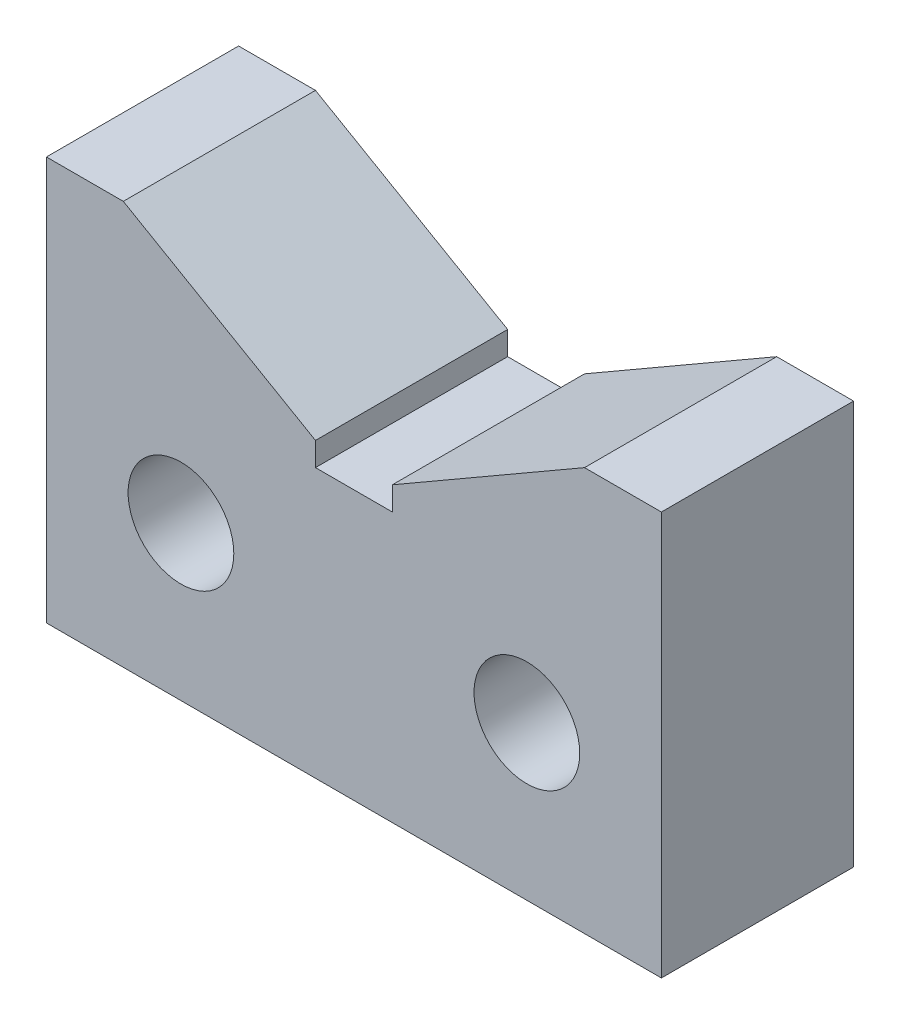
ISO-10303-21;
HEADER;
FILE_DESCRIPTION(('STEP AP214'),'2;1');
FILE_NAME('part.step','',(''),(''),'','','');
FILE_SCHEMA(('AUTOMOTIVE_DESIGN { 1 0 10303 214 1 1 1 1 }'));
ENDSEC;
DATA;
#1=APPLICATION_CONTEXT('core data for automotive mechanical design processes');
#2=APPLICATION_PROTOCOL_DEFINITION('international standard','automotive_design',2000,#1);
#3=PRODUCT_CONTEXT('',#1,'mechanical');
#4=PRODUCT('Part','Part','',(#3));
#5=PRODUCT_RELATED_PRODUCT_CATEGORY('part','',(#4));
#6=PRODUCT_DEFINITION_FORMATION('','',#4);
#7=PRODUCT_DEFINITION_CONTEXT('part definition',#1,'design');
#8=PRODUCT_DEFINITION('design','',#6,#7);
#9=PRODUCT_DEFINITION_SHAPE('','',#8);
#10=(LENGTH_UNIT() NAMED_UNIT(*) SI_UNIT(.MILLI.,.METRE.));
#11=(NAMED_UNIT(*) PLANE_ANGLE_UNIT() SI_UNIT($,.RADIAN.));
#12=(NAMED_UNIT(*) SI_UNIT($,.STERADIAN.) SOLID_ANGLE_UNIT());
#13=UNCERTAINTY_MEASURE_WITH_UNIT(LENGTH_MEASURE(1.E-05),#10,'distance_accuracy_value','');
#14=(GEOMETRIC_REPRESENTATION_CONTEXT(3) GLOBAL_UNCERTAINTY_ASSIGNED_CONTEXT((#13)) GLOBAL_UNIT_ASSIGNED_CONTEXT((#10,
#11,#12)) REPRESENTATION_CONTEXT('',''));
#15=CARTESIAN_POINT('',(0.,0.,0.));
#16=DIRECTION('',(0.,0.,1.));
#17=DIRECTION('',(1.,0.,0.));
#18=AXIS2_PLACEMENT_3D('',#15,#16,#17);
#19=CARTESIAN_POINT('',(0.,0.,10.));
#20=DIRECTION('',(0.,-1.,0.));
#21=DIRECTION('',(0.,0.,-1.));
#22=AXIS2_PLACEMENT_3D('',#19,#20,#21);
#23=PLANE('',#22);
#24=DIRECTION('',(-1.,0.,0.));
#25=VECTOR('',#24,1.);
#26=CARTESIAN_POINT('',(0.,0.,0.));
#27=LINE('',#26,#25);
#28=CARTESIAN_POINT('',(16.,0.,0.));
#29=VERTEX_POINT('',#28);
#30=CARTESIAN_POINT('',(-16.,0.,0.));
#31=VERTEX_POINT('',#30);
#32=EDGE_CURVE('E153',#29,#31,#27,.T.);
#33=ORIENTED_EDGE('',*,*,#32,.F.);
#34=DIRECTION('',(0.,0.,-1.));
#35=VECTOR('',#34,1.);
#36=CARTESIAN_POINT('',(16.,0.,10.));
#37=LINE('',#36,#35);
#38=CARTESIAN_POINT('',(16.,0.,10.));
#39=VERTEX_POINT('',#38);
#40=EDGE_CURVE('E11',#39,#29,#37,.T.);
#41=ORIENTED_EDGE('',*,*,#40,.F.);
#42=DIRECTION('',(-1.,0.,0.));
#43=VECTOR('',#42,1.);
#44=CARTESIAN_POINT('',(0.,0.,10.));
#45=LINE('',#44,#43);
#46=CARTESIAN_POINT('',(-16.,0.,10.));
#47=VERTEX_POINT('',#46);
#48=EDGE_CURVE('E254',#39,#47,#45,.T.);
#49=ORIENTED_EDGE('',*,*,#48,.T.);
#50=DIRECTION('',(0.,0.,-1.));
#51=VECTOR('',#50,1.);
#52=CARTESIAN_POINT('',(-16.,0.,10.));
#53=LINE('',#52,#51);
#54=EDGE_CURVE('E56',#47,#31,#53,.T.);
#55=ORIENTED_EDGE('',*,*,#54,.T.);
#56=EDGE_LOOP('',(#33,#41,#49,#55));
#57=FACE_BOUND('',#56,.T.);
#58=ADVANCED_FACE('F39',(#57),#23,.T.);
#59=CARTESIAN_POINT('',(16.,0.,10.));
#60=DIRECTION('',(-1.,0.,0.));
#61=DIRECTION('',(0.,0.,1.));
#62=AXIS2_PLACEMENT_3D('',#59,#60,#61);
#63=PLANE('',#62);
#64=DIRECTION('',(0.,1.,0.));
#65=VECTOR('',#64,1.);
#66=CARTESIAN_POINT('',(16.,0.,0.));
#67=LINE('',#66,#65);
#68=CARTESIAN_POINT('',(16.,21.,0.));
#69=VERTEX_POINT('',#68);
#70=EDGE_CURVE('E155',#29,#69,#67,.T.);
#71=ORIENTED_EDGE('',*,*,#70,.T.);
#72=DIRECTION('',(0.,0.,-1.));
#73=VECTOR('',#72,1.);
#74=CARTESIAN_POINT('',(16.,21.,10.));
#75=LINE('',#74,#73);
#76=CARTESIAN_POINT('',(16.,21.,10.));
#77=VERTEX_POINT('',#76);
#78=EDGE_CURVE('E48',#77,#69,#75,.T.);
#79=ORIENTED_EDGE('',*,*,#78,.F.);
#80=DIRECTION('',(0.,1.,0.));
#81=VECTOR('',#80,1.);
#82=CARTESIAN_POINT('',(16.,0.,10.));
#83=LINE('',#82,#81);
#84=EDGE_CURVE('E256',#39,#77,#83,.T.);
#85=ORIENTED_EDGE('',*,*,#84,.F.);
#86=ORIENTED_EDGE('',*,*,#40,.T.);
#87=EDGE_LOOP('',(#71,#79,#85,#86));
#88=FACE_BOUND('',#87,.T.);
#89=ADVANCED_FACE('F205',(#88),#63,.F.);
#90=CARTESIAN_POINT('',(0.,21.,10.));
#91=DIRECTION('',(0.,-1.,0.));
#92=DIRECTION('',(0.,0.,-1.));
#93=AXIS2_PLACEMENT_3D('',#90,#91,#92);
#94=PLANE('',#93);
#95=DIRECTION('',(-1.,0.,0.));
#96=VECTOR('',#95,1.);
#97=CARTESIAN_POINT('',(0.,21.,0.));
#98=LINE('',#97,#96);
#99=CARTESIAN_POINT('',(12.,21.,0.));
#100=VERTEX_POINT('',#99);
#101=EDGE_CURVE('E158',#69,#100,#98,.T.);
#102=ORIENTED_EDGE('',*,*,#101,.T.);
#103=DIRECTION('',(0.,0.,-1.));
#104=VECTOR('',#103,1.);
#105=CARTESIAN_POINT('',(12.,21.,10.));
#106=LINE('',#105,#104);
#107=CARTESIAN_POINT('',(12.,21.,10.));
#108=VERTEX_POINT('',#107);
#109=EDGE_CURVE('E193',#108,#100,#106,.T.);
#110=ORIENTED_EDGE('',*,*,#109,.F.);
#111=DIRECTION('',(-1.,0.,0.));
#112=VECTOR('',#111,1.);
#113=CARTESIAN_POINT('',(0.,21.,10.));
#114=LINE('',#113,#112);
#115=EDGE_CURVE('E201',#77,#108,#114,.T.);
#116=ORIENTED_EDGE('',*,*,#115,.F.);
#117=ORIENTED_EDGE('',*,*,#78,.T.);
#118=EDGE_LOOP('',(#102,#110,#116,#117));
#119=FACE_BOUND('',#118,.T.);
#120=ADVANCED_FACE('F198',(#119),#94,.F.);
#121=CARTESIAN_POINT('',(-6.0932667397366,10.5538475772934,10.));
#122=DIRECTION('',(0.499999999999998,-0.86602540378444,0.));
#123=DIRECTION('',(0.86602540378444,0.499999999999998,0.));
#124=AXIS2_PLACEMENT_3D('',#121,#122,#123);
#125=PLANE('',#124);
#126=DIRECTION('',(-0.86602540378444,-0.499999999999998,0.));
#127=VECTOR('',#126,1.);
#128=CARTESIAN_POINT('',(-6.0932667397366,10.5538475772934,0.));
#129=LINE('',#128,#127);
#130=CARTESIAN_POINT('',(2.,15.2264973081038,0.));
#131=VERTEX_POINT('',#130);
#132=EDGE_CURVE('E161',#100,#131,#129,.T.);
#133=ORIENTED_EDGE('',*,*,#132,.T.);
#134=DIRECTION('',(0.,0.,-1.));
#135=VECTOR('',#134,1.);
#136=CARTESIAN_POINT('',(2.,15.2264973081038,10.));
#137=LINE('',#136,#135);
#138=CARTESIAN_POINT('',(2.,15.2264973081038,10.));
#139=VERTEX_POINT('',#138);
#140=EDGE_CURVE('E190',#139,#131,#137,.T.);
#141=ORIENTED_EDGE('',*,*,#140,.F.);
#142=DIRECTION('',(-0.86602540378444,-0.499999999999998,0.));
#143=VECTOR('',#142,1.);
#144=CARTESIAN_POINT('',(-6.0932667397366,10.5538475772934,10.));
#145=LINE('',#144,#143);
#146=EDGE_CURVE('E261',#108,#139,#145,.T.);
#147=ORIENTED_EDGE('',*,*,#146,.F.);
#148=ORIENTED_EDGE('',*,*,#109,.T.);
#149=EDGE_LOOP('',(#133,#141,#147,#148));
#150=FACE_BOUND('',#149,.T.);
#151=ADVANCED_FACE('F217',(#150),#125,.F.);
#152=CARTESIAN_POINT('',(2.00000000000002,0.,10.));
#153=DIRECTION('',(1.,0.,0.));
#154=DIRECTION('',(0.,1.,0.));
#155=AXIS2_PLACEMENT_3D('',#152,#153,#154);
#156=PLANE('',#155);
#157=DIRECTION('',(0.,-1.,0.));
#158=VECTOR('',#157,1.);
#159=CARTESIAN_POINT('',(2.00000000000002,0.,0.));
#160=LINE('',#159,#158);
#161=CARTESIAN_POINT('',(2.,14.,0.));
#162=VERTEX_POINT('',#161);
#163=EDGE_CURVE('E164',#131,#162,#160,.T.);
#164=ORIENTED_EDGE('',*,*,#163,.T.);
#165=DIRECTION('',(0.,0.,-1.));
#166=VECTOR('',#165,1.);
#167=CARTESIAN_POINT('',(2.,14.,10.));
#168=LINE('',#167,#166);
#169=CARTESIAN_POINT('',(2.,14.,10.));
#170=VERTEX_POINT('',#169);
#171=EDGE_CURVE('E188',#170,#162,#168,.T.);
#172=ORIENTED_EDGE('',*,*,#171,.F.);
#173=DIRECTION('',(0.,-1.,0.));
#174=VECTOR('',#173,1.);
#175=CARTESIAN_POINT('',(2.00000000000002,0.,10.));
#176=LINE('',#175,#174);
#177=EDGE_CURVE('E264',#139,#170,#176,.T.);
#178=ORIENTED_EDGE('',*,*,#177,.F.);
#179=ORIENTED_EDGE('',*,*,#140,.T.);
#180=EDGE_LOOP('',(#164,#172,#178,#179));
#181=FACE_BOUND('',#180,.T.);
#182=ADVANCED_FACE('F220',(#181),#156,.F.);
#183=CARTESIAN_POINT('',(0.,14.,10.));
#184=DIRECTION('',(0.,1.,0.));
#185=DIRECTION('',(0.,0.,1.));
#186=AXIS2_PLACEMENT_3D('',#183,#184,#185);
#187=PLANE('',#186);
#188=DIRECTION('',(1.,0.,0.));
#189=VECTOR('',#188,1.);
#190=CARTESIAN_POINT('',(0.,14.,0.));
#191=LINE('',#190,#189);
#192=CARTESIAN_POINT('',(-2.,14.,0.));
#193=VERTEX_POINT('',#192);
#194=EDGE_CURVE('E167',#193,#162,#191,.T.);
#195=ORIENTED_EDGE('',*,*,#194,.F.);
#196=DIRECTION('',(0.,0.,-1.));
#197=VECTOR('',#196,1.);
#198=CARTESIAN_POINT('',(-2.,14.,10.));
#199=LINE('',#198,#197);
#200=CARTESIAN_POINT('',(-2.,14.,10.));
#201=VERTEX_POINT('',#200);
#202=EDGE_CURVE('E186',#201,#193,#199,.T.);
#203=ORIENTED_EDGE('',*,*,#202,.F.);
#204=DIRECTION('',(1.,0.,0.));
#205=VECTOR('',#204,1.);
#206=CARTESIAN_POINT('',(0.,14.,10.));
#207=LINE('',#206,#205);
#208=EDGE_CURVE('E266',#201,#170,#207,.T.);
#209=ORIENTED_EDGE('',*,*,#208,.T.);
#210=ORIENTED_EDGE('',*,*,#171,.T.);
#211=EDGE_LOOP('',(#195,#203,#209,#210));
#212=FACE_BOUND('',#211,.T.);
#213=ADVANCED_FACE('F224',(#212),#187,.T.);
#214=CARTESIAN_POINT('',(-2.00000000000002,0.,10.));
#215=DIRECTION('',(1.,0.,0.));
#216=DIRECTION('',(0.,1.,0.));
#217=AXIS2_PLACEMENT_3D('',#214,#215,#216);
#218=PLANE('',#217);
#219=DIRECTION('',(0.,-1.,0.));
#220=VECTOR('',#219,1.);
#221=CARTESIAN_POINT('',(-2.00000000000002,0.,0.));
#222=LINE('',#221,#220);
#223=CARTESIAN_POINT('',(-2.,15.2264973081038,0.));
#224=VERTEX_POINT('',#223);
#225=EDGE_CURVE('E170',#224,#193,#222,.T.);
#226=ORIENTED_EDGE('',*,*,#225,.F.);
#227=DIRECTION('',(0.,0.,-1.));
#228=VECTOR('',#227,1.);
#229=CARTESIAN_POINT('',(-2.,15.2264973081038,10.));
#230=LINE('',#229,#228);
#231=CARTESIAN_POINT('',(-2.,15.2264973081038,10.));
#232=VERTEX_POINT('',#231);
#233=EDGE_CURVE('E127',#232,#224,#230,.T.);
#234=ORIENTED_EDGE('',*,*,#233,.F.);
#235=DIRECTION('',(0.,-1.,0.));
#236=VECTOR('',#235,1.);
#237=CARTESIAN_POINT('',(-2.00000000000002,0.,10.));
#238=LINE('',#237,#236);
#239=EDGE_CURVE('E139',#232,#201,#238,.T.);
#240=ORIENTED_EDGE('',*,*,#239,.T.);
#241=ORIENTED_EDGE('',*,*,#202,.T.);
#242=EDGE_LOOP('',(#226,#234,#240,#241));
#243=FACE_BOUND('',#242,.T.);
#244=ADVANCED_FACE('F228',(#243),#218,.T.);
#245=CARTESIAN_POINT('',(6.0932667397366,10.5538475772934,10.));
#246=DIRECTION('',(0.499999999999998,0.86602540378444,0.));
#247=DIRECTION('',(-0.86602540378444,0.499999999999998,0.));
#248=AXIS2_PLACEMENT_3D('',#245,#246,#247);
#249=PLANE('',#248);
#250=DIRECTION('',(0.86602540378444,-0.499999999999998,0.));
#251=VECTOR('',#250,1.);
#252=CARTESIAN_POINT('',(6.0932667397366,10.5538475772934,0.));
#253=LINE('',#252,#251);
#254=CARTESIAN_POINT('',(-12.,21.,0.));
#255=VERTEX_POINT('',#254);
#256=EDGE_CURVE('E123',#255,#224,#253,.T.);
#257=ORIENTED_EDGE('',*,*,#256,.F.);
#258=DIRECTION('',(0.,0.,-1.));
#259=VECTOR('',#258,1.);
#260=CARTESIAN_POINT('',(-12.,21.,10.));
#261=LINE('',#260,#259);
#262=CARTESIAN_POINT('',(-12.,21.,10.));
#263=VERTEX_POINT('',#262);
#264=EDGE_CURVE('E118',#263,#255,#261,.T.);
#265=ORIENTED_EDGE('',*,*,#264,.F.);
#266=DIRECTION('',(0.86602540378444,-0.499999999999998,0.));
#267=VECTOR('',#266,1.);
#268=CARTESIAN_POINT('',(6.0932667397366,10.5538475772934,10.));
#269=LINE('',#268,#267);
#270=EDGE_CURVE('E121',#263,#232,#269,.T.);
#271=ORIENTED_EDGE('',*,*,#270,.T.);
#272=ORIENTED_EDGE('',*,*,#233,.T.);
#273=EDGE_LOOP('',(#257,#265,#271,#272));
#274=FACE_BOUND('',#273,.T.);
#275=ADVANCED_FACE('F120',(#274),#249,.T.);
#276=CARTESIAN_POINT('',(0.,21.,10.));
#277=DIRECTION('',(0.,1.,0.));
#278=DIRECTION('',(0.,0.,1.));
#279=AXIS2_PLACEMENT_3D('',#276,#277,#278);
#280=PLANE('',#279);
#281=DIRECTION('',(1.,0.,0.));
#282=VECTOR('',#281,1.);
#283=CARTESIAN_POINT('',(0.,21.,0.));
#284=LINE('',#283,#282);
#285=CARTESIAN_POINT('',(-16.,21.,0.));
#286=VERTEX_POINT('',#285);
#287=EDGE_CURVE('E174',#286,#255,#284,.T.);
#288=ORIENTED_EDGE('',*,*,#287,.F.);
#289=DIRECTION('',(0.,0.,-1.));
#290=VECTOR('',#289,1.);
#291=CARTESIAN_POINT('',(-16.,21.,10.));
#292=LINE('',#291,#290);
#293=CARTESIAN_POINT('',(-16.,21.,10.));
#294=VERTEX_POINT('',#293);
#295=EDGE_CURVE('E87',#294,#286,#292,.T.);
#296=ORIENTED_EDGE('',*,*,#295,.F.);
#297=DIRECTION('',(1.,0.,0.));
#298=VECTOR('',#297,1.);
#299=CARTESIAN_POINT('',(0.,21.,10.));
#300=LINE('',#299,#298);
#301=EDGE_CURVE('E136',#294,#263,#300,.T.);
#302=ORIENTED_EDGE('',*,*,#301,.T.);
#303=ORIENTED_EDGE('',*,*,#264,.T.);
#304=EDGE_LOOP('',(#288,#296,#302,#303));
#305=FACE_BOUND('',#304,.T.);
#306=ADVANCED_FACE('F141',(#305),#280,.T.);
#307=CARTESIAN_POINT('',(-16.,0.,10.));
#308=DIRECTION('',(-1.,0.,0.));
#309=DIRECTION('',(0.,0.,1.));
#310=AXIS2_PLACEMENT_3D('',#307,#308,#309);
#311=PLANE('',#310);
#312=DIRECTION('',(0.,1.,0.));
#313=VECTOR('',#312,1.);
#314=CARTESIAN_POINT('',(-16.,0.,0.));
#315=LINE('',#314,#313);
#316=EDGE_CURVE('E176',#31,#286,#315,.T.);
#317=ORIENTED_EDGE('',*,*,#316,.F.);
#318=ORIENTED_EDGE('',*,*,#54,.F.);
#319=DIRECTION('',(0.,1.,0.));
#320=VECTOR('',#319,1.);
#321=CARTESIAN_POINT('',(-16.,0.,10.));
#322=LINE('',#321,#320);
#323=EDGE_CURVE('E142',#47,#294,#322,.T.);
#324=ORIENTED_EDGE('',*,*,#323,.T.);
#325=ORIENTED_EDGE('',*,*,#295,.T.);
#326=EDGE_LOOP('',(#317,#318,#324,#325));
#327=FACE_BOUND('',#326,.T.);
#328=ADVANCED_FACE('F237',(#327),#311,.T.);
#329=CARTESIAN_POINT('',(-9.,8.,10.));
#330=DIRECTION('',(0.,0.,-1.));
#331=DIRECTION('',(-1.,0.,0.));
#332=AXIS2_PLACEMENT_3D('',#329,#330,#331);
#333=CYLINDRICAL_SURFACE('',#332,2.75);
#334=CARTESIAN_POINT('',(-9.,8.,10.));
#335=DIRECTION('',(0.,0.,1.));
#336=DIRECTION('',(1.,0.,0.));
#337=AXIS2_PLACEMENT_3D('',#334,#335,#336);
#338=CIRCLE('',#337,2.75);
#339=CARTESIAN_POINT('',(-6.25,8.,10.));
#340=VERTEX_POINT('',#339);
#341=EDGE_CURVE('E182',#340,#340,#338,.T.);
#342=ORIENTED_EDGE('',*,*,#341,.T.);
#343=EDGE_LOOP('',(#342));
#344=FACE_BOUND('',#343,.T.);
#345=CARTESIAN_POINT('',(-9.,8.,0.));
#346=DIRECTION('',(0.,0.,1.));
#347=DIRECTION('',(1.,0.,0.));
#348=AXIS2_PLACEMENT_3D('',#345,#346,#347);
#349=CIRCLE('',#348,2.75);
#350=CARTESIAN_POINT('',(-6.25,8.,0.));
#351=VERTEX_POINT('',#350);
#352=EDGE_CURVE('E150',#351,#351,#349,.T.);
#353=ORIENTED_EDGE('',*,*,#352,.F.);
#354=EDGE_LOOP('',(#353));
#355=FACE_BOUND('',#354,.T.);
#356=ADVANCED_FACE('F41',(#344,#355),#333,.F.);
#357=CARTESIAN_POINT('',(9.,8.,10.));
#358=DIRECTION('',(0.,0.,-1.));
#359=DIRECTION('',(-1.,0.,0.));
#360=AXIS2_PLACEMENT_3D('',#357,#358,#359);
#361=CYLINDRICAL_SURFACE('',#360,2.75);
#362=CARTESIAN_POINT('',(9.,8.,10.));
#363=DIRECTION('',(0.,0.,1.));
#364=DIRECTION('',(1.,0.,0.));
#365=AXIS2_PLACEMENT_3D('',#362,#363,#364);
#366=CIRCLE('',#365,2.75);
#367=CARTESIAN_POINT('',(11.75,8.,10.));
#368=VERTEX_POINT('',#367);
#369=EDGE_CURVE('E144',#368,#368,#366,.F.);
#370=ORIENTED_EDGE('',*,*,#369,.F.);
#371=EDGE_LOOP('',(#370));
#372=FACE_BOUND('',#371,.T.);
#373=CARTESIAN_POINT('',(9.,8.,0.));
#374=DIRECTION('',(0.,0.,1.));
#375=DIRECTION('',(1.,0.,0.));
#376=AXIS2_PLACEMENT_3D('',#373,#374,#375);
#377=CIRCLE('',#376,2.75);
#378=CARTESIAN_POINT('',(11.75,8.,0.));
#379=VERTEX_POINT('',#378);
#380=EDGE_CURVE('E179',#379,#379,#377,.F.);
#381=ORIENTED_EDGE('',*,*,#380,.T.);
#382=EDGE_LOOP('',(#381));
#383=FACE_BOUND('',#382,.T.);
#384=ADVANCED_FACE('F240',(#372,#383),#361,.F.);
#385=CARTESIAN_POINT('',(0.,0.,10.));
#386=DIRECTION('',(0.,0.,1.));
#387=DIRECTION('',(1.,0.,0.));
#388=AXIS2_PLACEMENT_3D('',#385,#386,#387);
#389=PLANE('',#388);
#390=ORIENTED_EDGE('',*,*,#341,.F.);
#391=EDGE_LOOP('',(#390));
#392=FACE_BOUND('',#391,.T.);
#393=ORIENTED_EDGE('',*,*,#48,.F.);
#394=ORIENTED_EDGE('',*,*,#84,.T.);
#395=ORIENTED_EDGE('',*,*,#115,.T.);
#396=ORIENTED_EDGE('',*,*,#146,.T.);
#397=ORIENTED_EDGE('',*,*,#177,.T.);
#398=ORIENTED_EDGE('',*,*,#208,.F.);
#399=ORIENTED_EDGE('',*,*,#239,.F.);
#400=ORIENTED_EDGE('',*,*,#270,.F.);
#401=ORIENTED_EDGE('',*,*,#301,.F.);
#402=ORIENTED_EDGE('',*,*,#323,.F.);
#403=EDGE_LOOP('',(#393,#394,#395,#396,#397,#398,#399,#400,#401,#402));
#404=FACE_BOUND('',#403,.T.);
#405=ORIENTED_EDGE('',*,*,#369,.T.);
#406=EDGE_LOOP('',(#405));
#407=FACE_BOUND('',#406,.T.);
#408=ADVANCED_FACE('F133',(#392,#404,#407),#389,.T.);
#409=CARTESIAN_POINT('',(0.,0.,0.));
#410=DIRECTION('',(0.,0.,1.));
#411=DIRECTION('',(1.,0.,0.));
#412=AXIS2_PLACEMENT_3D('',#409,#410,#411);
#413=PLANE('',#412);
#414=ORIENTED_EDGE('',*,*,#352,.T.);
#415=EDGE_LOOP('',(#414));
#416=FACE_BOUND('',#415,.T.);
#417=ORIENTED_EDGE('',*,*,#32,.T.);
#418=ORIENTED_EDGE('',*,*,#316,.T.);
#419=ORIENTED_EDGE('',*,*,#287,.T.);
#420=ORIENTED_EDGE('',*,*,#256,.T.);
#421=ORIENTED_EDGE('',*,*,#225,.T.);
#422=ORIENTED_EDGE('',*,*,#194,.T.);
#423=ORIENTED_EDGE('',*,*,#163,.F.);
#424=ORIENTED_EDGE('',*,*,#132,.F.);
#425=ORIENTED_EDGE('',*,*,#101,.F.);
#426=ORIENTED_EDGE('',*,*,#70,.F.);
#427=EDGE_LOOP('',(#417,#418,#419,#420,#421,#422,#423,#424,#425,#426));
#428=FACE_BOUND('',#427,.T.);
#429=ORIENTED_EDGE('',*,*,#380,.F.);
#430=EDGE_LOOP('',(#429));
#431=FACE_BOUND('',#430,.T.);
#432=ADVANCED_FACE('F207',(#416,#428,#431),#413,.F.);
#433=CLOSED_SHELL('',(#58,#89,#120,#151,#182,#213,#244,#275,#306,#328,#356,#384,#408,#432));
#434=MANIFOLD_SOLID_BREP('B2',#433);
#435=ADVANCED_BREP_SHAPE_REPRESENTATION('',(#18,#434),#14);
#436=SHAPE_DEFINITION_REPRESENTATION(#9,#435);
ENDSEC;
END-ISO-10303-21;
